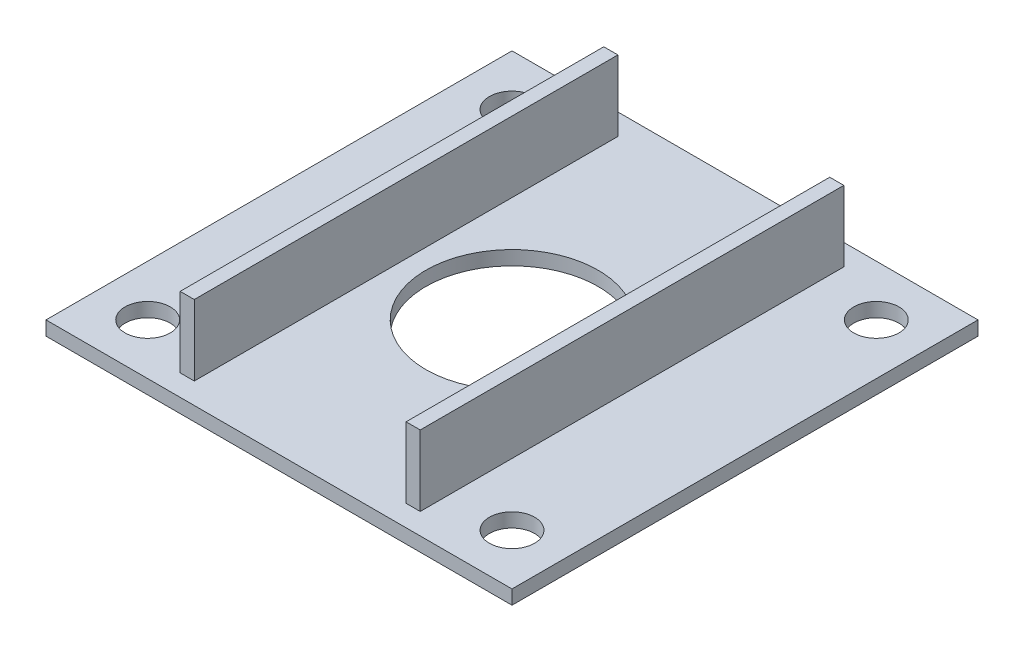
ISO-10303-21;
HEADER;
FILE_DESCRIPTION(('STEP AP214'),'2;1');
FILE_NAME('part.step','',(''),(''),'','','');
FILE_SCHEMA(('AUTOMOTIVE_DESIGN { 1 0 10303 214 1 1 1 1 }'));
ENDSEC;
DATA;
#1=APPLICATION_CONTEXT('core data for automotive mechanical design processes');
#2=APPLICATION_PROTOCOL_DEFINITION('international standard','automotive_design',2000,#1);
#3=PRODUCT_CONTEXT('',#1,'mechanical');
#4=PRODUCT('Part','Part','',(#3));
#5=PRODUCT_RELATED_PRODUCT_CATEGORY('part','',(#4));
#6=PRODUCT_DEFINITION_FORMATION('','',#4);
#7=PRODUCT_DEFINITION_CONTEXT('part definition',#1,'design');
#8=PRODUCT_DEFINITION('design','',#6,#7);
#9=PRODUCT_DEFINITION_SHAPE('','',#8);
#10=(LENGTH_UNIT() NAMED_UNIT(*) SI_UNIT(.MILLI.,.METRE.));
#11=(NAMED_UNIT(*) PLANE_ANGLE_UNIT() SI_UNIT($,.RADIAN.));
#12=(NAMED_UNIT(*) SI_UNIT($,.STERADIAN.) SOLID_ANGLE_UNIT());
#13=UNCERTAINTY_MEASURE_WITH_UNIT(LENGTH_MEASURE(1.E-05),#10,'distance_accuracy_value','');
#14=(GEOMETRIC_REPRESENTATION_CONTEXT(3) GLOBAL_UNCERTAINTY_ASSIGNED_CONTEXT((#13)) GLOBAL_UNIT_ASSIGNED_CONTEXT((#10,
#11,#12)) REPRESENTATION_CONTEXT('',''));
#15=CARTESIAN_POINT('',(0.,0.,0.));
#16=DIRECTION('',(0.,0.,1.));
#17=DIRECTION('',(1.,0.,0.));
#18=AXIS2_PLACEMENT_3D('',#15,#16,#17);
#19=CARTESIAN_POINT('',(0.,1.,0.));
#20=DIRECTION('',(0.,1.,0.));
#21=DIRECTION('',(0.,0.,1.));
#22=AXIS2_PLACEMENT_3D('',#19,#20,#21);
#23=PLANE('',#22);
#24=CARTESIAN_POINT('',(-12.9,1.,12.9));
#25=DIRECTION('',(0.,1.,0.));
#26=DIRECTION('',(0.,0.,-1.));
#27=AXIS2_PLACEMENT_3D('',#24,#25,#26);
#28=CIRCLE('',#27,1.6);
#29=CARTESIAN_POINT('',(-12.9,1.,11.3));
#30=VERTEX_POINT('',#29);
#31=EDGE_CURVE('E202',#30,#30,#28,.T.);
#32=ORIENTED_EDGE('',*,*,#31,.F.);
#33=EDGE_LOOP('',(#32));
#34=FACE_BOUND('',#33,.T.);
#35=CARTESIAN_POINT('',(12.9,1.,12.9));
#36=DIRECTION('',(0.,1.,0.));
#37=DIRECTION('',(0.,0.,1.));
#38=AXIS2_PLACEMENT_3D('',#35,#36,#37);
#39=CIRCLE('',#38,1.6);
#40=CARTESIAN_POINT('',(12.9,1.,14.5));
#41=VERTEX_POINT('',#40);
#42=EDGE_CURVE('E224',#41,#41,#39,.T.);
#43=ORIENTED_EDGE('',*,*,#42,.F.);
#44=EDGE_LOOP('',(#43));
#45=FACE_BOUND('',#44,.T.);
#46=CARTESIAN_POINT('',(12.9,1.,-12.9));
#47=DIRECTION('',(0.,1.,0.));
#48=DIRECTION('',(0.,0.,-1.));
#49=AXIS2_PLACEMENT_3D('',#46,#47,#48);
#50=CIRCLE('',#49,1.6);
#51=CARTESIAN_POINT('',(12.9,1.,-14.5));
#52=VERTEX_POINT('',#51);
#53=EDGE_CURVE('E216',#52,#52,#50,.T.);
#54=ORIENTED_EDGE('',*,*,#53,.F.);
#55=EDGE_LOOP('',(#54));
#56=FACE_BOUND('',#55,.T.);
#57=CARTESIAN_POINT('',(-12.9,1.,-12.9));
#58=DIRECTION('',(0.,1.,0.));
#59=DIRECTION('',(0.,0.,1.));
#60=AXIS2_PLACEMENT_3D('',#57,#58,#59);
#61=CIRCLE('',#60,1.6);
#62=CARTESIAN_POINT('',(-12.9,1.,-11.3));
#63=VERTEX_POINT('',#62);
#64=EDGE_CURVE('E208',#63,#63,#61,.T.);
#65=ORIENTED_EDGE('',*,*,#64,.F.);
#66=EDGE_LOOP('',(#65));
#67=FACE_BOUND('',#66,.T.);
#68=CARTESIAN_POINT('',(0.,1.,0.));
#69=DIRECTION('',(0.,1.,0.));
#70=DIRECTION('',(0.,0.,1.));
#71=AXIS2_PLACEMENT_3D('',#68,#69,#70);
#72=CIRCLE('',#71,6.1);
#73=CARTESIAN_POINT('',(0.,1.,6.1));
#74=VERTEX_POINT('',#73);
#75=EDGE_CURVE('E207',#74,#74,#72,.T.);
#76=ORIENTED_EDGE('',*,*,#75,.F.);
#77=EDGE_LOOP('',(#76));
#78=FACE_BOUND('',#77,.T.);
#79=DIRECTION('',(0.,0.,-1.));
#80=VECTOR('',#79,1.);
#81=CARTESIAN_POINT('',(16.5,1.,-16.5));
#82=LINE('',#81,#80);
#83=CARTESIAN_POINT('',(16.5,1.,16.5));
#84=VERTEX_POINT('',#83);
#85=CARTESIAN_POINT('',(16.5,1.,-16.5));
#86=VERTEX_POINT('',#85);
#87=EDGE_CURVE('E243',#84,#86,#82,.T.);
#88=ORIENTED_EDGE('',*,*,#87,.T.);
#89=DIRECTION('',(-1.,0.,0.));
#90=VECTOR('',#89,1.);
#91=CARTESIAN_POINT('',(-16.5,1.,-16.5));
#92=LINE('',#91,#90);
#93=CARTESIAN_POINT('',(-16.5,1.,-16.5));
#94=VERTEX_POINT('',#93);
#95=EDGE_CURVE('E247',#86,#94,#92,.T.);
#96=ORIENTED_EDGE('',*,*,#95,.T.);
#97=DIRECTION('',(0.,0.,1.));
#98=VECTOR('',#97,1.);
#99=CARTESIAN_POINT('',(-16.5,1.,-16.5));
#100=LINE('',#99,#98);
#101=CARTESIAN_POINT('',(-16.5,1.,16.5));
#102=VERTEX_POINT('',#101);
#103=EDGE_CURVE('E251',#94,#102,#100,.T.);
#104=ORIENTED_EDGE('',*,*,#103,.T.);
#105=DIRECTION('',(1.,0.,0.));
#106=VECTOR('',#105,1.);
#107=CARTESIAN_POINT('',(-16.5,1.,16.5));
#108=LINE('',#107,#106);
#109=EDGE_CURVE('E254',#102,#84,#108,.T.);
#110=ORIENTED_EDGE('',*,*,#109,.T.);
#111=EDGE_LOOP('',(#88,#96,#104,#110));
#112=FACE_BOUND('',#111,.T.);
#113=DIRECTION('',(1.,0.,0.));
#114=VECTOR('',#113,1.);
#115=CARTESIAN_POINT('',(-8.5,1.,15.));
#116=LINE('',#115,#114);
#117=CARTESIAN_POINT('',(-8.5,1.,15.));
#118=VERTEX_POINT('',#117);
#119=CARTESIAN_POINT('',(-7.5,1.,15.));
#120=VERTEX_POINT('',#119);
#121=EDGE_CURVE('E163',#118,#120,#116,.T.);
#122=ORIENTED_EDGE('',*,*,#121,.F.);
#123=DIRECTION('',(0.,0.,1.));
#124=VECTOR('',#123,1.);
#125=CARTESIAN_POINT('',(-8.5,1.,-15.));
#126=LINE('',#125,#124);
#127=CARTESIAN_POINT('',(-8.5,1.,-15.));
#128=VERTEX_POINT('',#127);
#129=EDGE_CURVE('E158',#128,#118,#126,.T.);
#130=ORIENTED_EDGE('',*,*,#129,.F.);
#131=DIRECTION('',(-1.,0.,0.));
#132=VECTOR('',#131,1.);
#133=CARTESIAN_POINT('',(-8.5,1.,-15.));
#134=LINE('',#133,#132);
#135=CARTESIAN_POINT('',(-7.5,1.,-15.));
#136=VERTEX_POINT('',#135);
#137=EDGE_CURVE('E173',#136,#128,#134,.T.);
#138=ORIENTED_EDGE('',*,*,#137,.F.);
#139=DIRECTION('',(0.,0.,-1.));
#140=VECTOR('',#139,1.);
#141=CARTESIAN_POINT('',(-7.5,1.,-15.));
#142=LINE('',#141,#140);
#143=EDGE_CURVE('E185',#120,#136,#142,.T.);
#144=ORIENTED_EDGE('',*,*,#143,.F.);
#145=EDGE_LOOP('',(#122,#130,#138,#144));
#146=FACE_BOUND('',#145,.T.);
#147=DIRECTION('',(0.,0.,1.));
#148=VECTOR('',#147,1.);
#149=CARTESIAN_POINT('',(7.5,1.,-15.));
#150=LINE('',#149,#148);
#151=CARTESIAN_POINT('',(7.5,1.,-15.));
#152=VERTEX_POINT('',#151);
#153=CARTESIAN_POINT('',(7.5,1.,15.));
#154=VERTEX_POINT('',#153);
#155=EDGE_CURVE('E499',#152,#154,#150,.T.);
#156=ORIENTED_EDGE('',*,*,#155,.F.);
#157=DIRECTION('',(-1.,0.,0.));
#158=VECTOR('',#157,1.);
#159=CARTESIAN_POINT('',(8.5,1.,-15.));
#160=LINE('',#159,#158);
#161=CARTESIAN_POINT('',(8.5,1.,-15.));
#162=VERTEX_POINT('',#161);
#163=EDGE_CURVE('E155',#162,#152,#160,.T.);
#164=ORIENTED_EDGE('',*,*,#163,.F.);
#165=DIRECTION('',(0.,0.,-1.));
#166=VECTOR('',#165,1.);
#167=CARTESIAN_POINT('',(8.5,1.,-15.));
#168=LINE('',#167,#166);
#169=CARTESIAN_POINT('',(8.5,1.,15.));
#170=VERTEX_POINT('',#169);
#171=EDGE_CURVE('E151',#170,#162,#168,.T.);
#172=ORIENTED_EDGE('',*,*,#171,.F.);
#173=DIRECTION('',(1.,0.,0.));
#174=VECTOR('',#173,1.);
#175=CARTESIAN_POINT('',(8.5,1.,15.));
#176=LINE('',#175,#174);
#177=EDGE_CURVE('E495',#154,#170,#176,.T.);
#178=ORIENTED_EDGE('',*,*,#177,.F.);
#179=EDGE_LOOP('',(#156,#164,#172,#178));
#180=FACE_BOUND('',#179,.T.);
#181=ADVANCED_FACE('F39',(#34,#45,#56,#67,#78,#112,#146,#180),#23,.T.);
#182=CARTESIAN_POINT('',(16.5,1.,-16.5));
#183=DIRECTION('',(-1.,0.,0.));
#184=DIRECTION('',(0.,0.,1.));
#185=AXIS2_PLACEMENT_3D('',#182,#183,#184);
#186=PLANE('',#185);
#187=DIRECTION('',(0.,0.,-1.));
#188=VECTOR('',#187,1.);
#189=CARTESIAN_POINT('',(16.5,0.,-16.5));
#190=LINE('',#189,#188);
#191=CARTESIAN_POINT('',(16.5,0.,16.5));
#192=VERTEX_POINT('',#191);
#193=CARTESIAN_POINT('',(16.5,0.,-16.5));
#194=VERTEX_POINT('',#193);
#195=EDGE_CURVE('E239',#192,#194,#190,.T.);
#196=ORIENTED_EDGE('',*,*,#195,.T.);
#197=DIRECTION('',(0.,-1.,0.));
#198=VECTOR('',#197,1.);
#199=CARTESIAN_POINT('',(16.5,1.,-16.5));
#200=LINE('',#199,#198);
#201=EDGE_CURVE('E11',#86,#194,#200,.T.);
#202=ORIENTED_EDGE('',*,*,#201,.F.);
#203=ORIENTED_EDGE('',*,*,#87,.F.);
#204=DIRECTION('',(0.,-1.,0.));
#205=VECTOR('',#204,1.);
#206=CARTESIAN_POINT('',(16.5,1.,16.5));
#207=LINE('',#206,#205);
#208=EDGE_CURVE('E257',#84,#192,#207,.T.);
#209=ORIENTED_EDGE('',*,*,#208,.T.);
#210=EDGE_LOOP('',(#196,#202,#203,#209));
#211=FACE_BOUND('',#210,.T.);
#212=ADVANCED_FACE('F41',(#211),#186,.F.);
#213=CARTESIAN_POINT('',(-16.5,1.,-16.5));
#214=DIRECTION('',(0.,0.,1.));
#215=DIRECTION('',(1.,0.,0.));
#216=AXIS2_PLACEMENT_3D('',#213,#214,#215);
#217=PLANE('',#216);
#218=DIRECTION('',(-1.,0.,0.));
#219=VECTOR('',#218,1.);
#220=CARTESIAN_POINT('',(-16.5,0.,-16.5));
#221=LINE('',#220,#219);
#222=CARTESIAN_POINT('',(-16.5,0.,-16.5));
#223=VERTEX_POINT('',#222);
#224=EDGE_CURVE('E261',#194,#223,#221,.T.);
#225=ORIENTED_EDGE('',*,*,#224,.T.);
#226=DIRECTION('',(0.,-1.,0.));
#227=VECTOR('',#226,1.);
#228=CARTESIAN_POINT('',(-16.5,1.,-16.5));
#229=LINE('',#228,#227);
#230=EDGE_CURVE('E48',#94,#223,#229,.T.);
#231=ORIENTED_EDGE('',*,*,#230,.F.);
#232=ORIENTED_EDGE('',*,*,#95,.F.);
#233=ORIENTED_EDGE('',*,*,#201,.T.);
#234=EDGE_LOOP('',(#225,#231,#232,#233));
#235=FACE_BOUND('',#234,.T.);
#236=ADVANCED_FACE('F297',(#235),#217,.F.);
#237=CARTESIAN_POINT('',(-16.5,1.,-16.5));
#238=DIRECTION('',(1.,0.,0.));
#239=DIRECTION('',(0.,0.,-1.));
#240=AXIS2_PLACEMENT_3D('',#237,#238,#239);
#241=PLANE('',#240);
#242=DIRECTION('',(0.,0.,1.));
#243=VECTOR('',#242,1.);
#244=CARTESIAN_POINT('',(-16.5,0.,-16.5));
#245=LINE('',#244,#243);
#246=CARTESIAN_POINT('',(-16.5,0.,16.5));
#247=VERTEX_POINT('',#246);
#248=EDGE_CURVE('E264',#223,#247,#245,.T.);
#249=ORIENTED_EDGE('',*,*,#248,.T.);
#250=DIRECTION('',(0.,-1.,0.));
#251=VECTOR('',#250,1.);
#252=CARTESIAN_POINT('',(-16.5,1.,16.5));
#253=LINE('',#252,#251);
#254=EDGE_CURVE('E272',#102,#247,#253,.T.);
#255=ORIENTED_EDGE('',*,*,#254,.F.);
#256=ORIENTED_EDGE('',*,*,#103,.F.);
#257=ORIENTED_EDGE('',*,*,#230,.T.);
#258=EDGE_LOOP('',(#249,#255,#256,#257));
#259=FACE_BOUND('',#258,.T.);
#260=ADVANCED_FACE('F281',(#259),#241,.F.);
#261=CARTESIAN_POINT('',(-16.5,1.,16.5));
#262=DIRECTION('',(0.,0.,-1.));
#263=DIRECTION('',(-1.,0.,0.));
#264=AXIS2_PLACEMENT_3D('',#261,#262,#263);
#265=PLANE('',#264);
#266=DIRECTION('',(1.,0.,0.));
#267=VECTOR('',#266,1.);
#268=CARTESIAN_POINT('',(-16.5,0.,16.5));
#269=LINE('',#268,#267);
#270=EDGE_CURVE('E248',#247,#192,#269,.T.);
#271=ORIENTED_EDGE('',*,*,#270,.T.);
#272=ORIENTED_EDGE('',*,*,#208,.F.);
#273=ORIENTED_EDGE('',*,*,#109,.F.);
#274=ORIENTED_EDGE('',*,*,#254,.T.);
#275=EDGE_LOOP('',(#271,#272,#273,#274));
#276=FACE_BOUND('',#275,.T.);
#277=ADVANCED_FACE('F290',(#276),#265,.F.);
#278=CARTESIAN_POINT('',(0.,0.,0.));
#279=DIRECTION('',(0.,1.,0.));
#280=DIRECTION('',(0.,0.,1.));
#281=AXIS2_PLACEMENT_3D('',#278,#279,#280);
#282=PLANE('',#281);
#283=CARTESIAN_POINT('',(-12.9,0.,12.9));
#284=DIRECTION('',(0.,1.,0.));
#285=DIRECTION('',(0.,0.,-1.));
#286=AXIS2_PLACEMENT_3D('',#283,#284,#285);
#287=CIRCLE('',#286,1.6);
#288=CARTESIAN_POINT('',(-12.9,0.,11.3));
#289=VERTEX_POINT('',#288);
#290=EDGE_CURVE('E228',#289,#289,#287,.T.);
#291=ORIENTED_EDGE('',*,*,#290,.T.);
#292=EDGE_LOOP('',(#291));
#293=FACE_BOUND('',#292,.T.);
#294=CARTESIAN_POINT('',(12.9,0.,12.9));
#295=DIRECTION('',(0.,1.,0.));
#296=DIRECTION('',(0.,0.,1.));
#297=AXIS2_PLACEMENT_3D('',#294,#295,#296);
#298=CIRCLE('',#297,1.6);
#299=CARTESIAN_POINT('',(12.9,0.,14.5));
#300=VERTEX_POINT('',#299);
#301=EDGE_CURVE('E220',#300,#300,#298,.T.);
#302=ORIENTED_EDGE('',*,*,#301,.T.);
#303=EDGE_LOOP('',(#302));
#304=FACE_BOUND('',#303,.T.);
#305=CARTESIAN_POINT('',(12.9,0.,-12.9));
#306=DIRECTION('',(0.,1.,0.));
#307=DIRECTION('',(0.,0.,-1.));
#308=AXIS2_PLACEMENT_3D('',#305,#306,#307);
#309=CIRCLE('',#308,1.6);
#310=CARTESIAN_POINT('',(12.9,0.,-14.5));
#311=VERTEX_POINT('',#310);
#312=EDGE_CURVE('E212',#311,#311,#309,.T.);
#313=ORIENTED_EDGE('',*,*,#312,.T.);
#314=EDGE_LOOP('',(#313));
#315=FACE_BOUND('',#314,.T.);
#316=CARTESIAN_POINT('',(-12.9,0.,-12.9));
#317=DIRECTION('',(0.,1.,0.));
#318=DIRECTION('',(0.,0.,1.));
#319=AXIS2_PLACEMENT_3D('',#316,#317,#318);
#320=CIRCLE('',#319,1.6);
#321=CARTESIAN_POINT('',(-12.9,0.,-11.3));
#322=VERTEX_POINT('',#321);
#323=EDGE_CURVE('E203',#322,#322,#320,.T.);
#324=ORIENTED_EDGE('',*,*,#323,.T.);
#325=EDGE_LOOP('',(#324));
#326=FACE_BOUND('',#325,.T.);
#327=CARTESIAN_POINT('',(0.,0.,0.));
#328=DIRECTION('',(0.,1.,0.));
#329=DIRECTION('',(0.,0.,1.));
#330=AXIS2_PLACEMENT_3D('',#327,#328,#329);
#331=CIRCLE('',#330,6.1);
#332=CARTESIAN_POINT('',(0.,0.,6.1));
#333=VERTEX_POINT('',#332);
#334=EDGE_CURVE('E235',#333,#333,#331,.T.);
#335=ORIENTED_EDGE('',*,*,#334,.T.);
#336=EDGE_LOOP('',(#335));
#337=FACE_BOUND('',#336,.T.);
#338=ORIENTED_EDGE('',*,*,#195,.F.);
#339=ORIENTED_EDGE('',*,*,#270,.F.);
#340=ORIENTED_EDGE('',*,*,#248,.F.);
#341=ORIENTED_EDGE('',*,*,#224,.F.);
#342=EDGE_LOOP('',(#338,#339,#340,#341));
#343=FACE_BOUND('',#342,.T.);
#344=ADVANCED_FACE('F287',(#293,#304,#315,#326,#337,#343),#282,.F.);
#345=CARTESIAN_POINT('',(0.,0.,0.));
#346=DIRECTION('',(0.,1.,0.));
#347=DIRECTION('',(0.,0.,1.));
#348=AXIS2_PLACEMENT_3D('',#345,#346,#347);
#349=CYLINDRICAL_SURFACE('',#348,6.1);
#350=ORIENTED_EDGE('',*,*,#334,.F.);
#351=EDGE_LOOP('',(#350));
#352=FACE_BOUND('',#351,.T.);
#353=ORIENTED_EDGE('',*,*,#75,.T.);
#354=EDGE_LOOP('',(#353));
#355=FACE_BOUND('',#354,.T.);
#356=ADVANCED_FACE('F313',(#352,#355),#349,.F.);
#357=CARTESIAN_POINT('',(-12.9,0.,-12.9));
#358=DIRECTION('',(0.,1.,0.));
#359=DIRECTION('',(0.,0.,1.));
#360=AXIS2_PLACEMENT_3D('',#357,#358,#359);
#361=CYLINDRICAL_SURFACE('',#360,1.6);
#362=ORIENTED_EDGE('',*,*,#323,.F.);
#363=EDGE_LOOP('',(#362));
#364=FACE_BOUND('',#363,.T.);
#365=ORIENTED_EDGE('',*,*,#64,.T.);
#366=EDGE_LOOP('',(#365));
#367=FACE_BOUND('',#366,.T.);
#368=ADVANCED_FACE('F333',(#364,#367),#361,.F.);
#369=CARTESIAN_POINT('',(12.9,0.,-12.9));
#370=DIRECTION('',(0.,1.,0.));
#371=DIRECTION('',(0.,0.,1.));
#372=AXIS2_PLACEMENT_3D('',#369,#370,#371);
#373=CYLINDRICAL_SURFACE('',#372,1.6);
#374=ORIENTED_EDGE('',*,*,#312,.F.);
#375=EDGE_LOOP('',(#374));
#376=FACE_BOUND('',#375,.T.);
#377=ORIENTED_EDGE('',*,*,#53,.T.);
#378=EDGE_LOOP('',(#377));
#379=FACE_BOUND('',#378,.T.);
#380=ADVANCED_FACE('F340',(#376,#379),#373,.F.);
#381=CARTESIAN_POINT('',(12.9,0.,12.9));
#382=DIRECTION('',(0.,1.,0.));
#383=DIRECTION('',(0.,0.,1.));
#384=AXIS2_PLACEMENT_3D('',#381,#382,#383);
#385=CYLINDRICAL_SURFACE('',#384,1.6);
#386=ORIENTED_EDGE('',*,*,#301,.F.);
#387=EDGE_LOOP('',(#386));
#388=FACE_BOUND('',#387,.T.);
#389=ORIENTED_EDGE('',*,*,#42,.T.);
#390=EDGE_LOOP('',(#389));
#391=FACE_BOUND('',#390,.T.);
#392=ADVANCED_FACE('F348',(#388,#391),#385,.F.);
#393=CARTESIAN_POINT('',(-12.9,0.,12.9));
#394=DIRECTION('',(0.,1.,0.));
#395=DIRECTION('',(0.,0.,1.));
#396=AXIS2_PLACEMENT_3D('',#393,#394,#395);
#397=CYLINDRICAL_SURFACE('',#396,1.6);
#398=ORIENTED_EDGE('',*,*,#290,.F.);
#399=EDGE_LOOP('',(#398));
#400=FACE_BOUND('',#399,.T.);
#401=ORIENTED_EDGE('',*,*,#31,.T.);
#402=EDGE_LOOP('',(#401));
#403=FACE_BOUND('',#402,.T.);
#404=ADVANCED_FACE('F356',(#400,#403),#397,.F.);
#405=CARTESIAN_POINT('',(-8.5,6.,-15.));
#406=DIRECTION('',(1.,0.,0.));
#407=DIRECTION('',(0.,0.,-1.));
#408=AXIS2_PLACEMENT_3D('',#405,#406,#407);
#409=PLANE('',#408);
#410=ORIENTED_EDGE('',*,*,#129,.T.);
#411=DIRECTION('',(0.,-1.,0.));
#412=VECTOR('',#411,1.);
#413=CARTESIAN_POINT('',(-8.5,6.,15.));
#414=LINE('',#413,#412);
#415=CARTESIAN_POINT('',(-8.5,6.,15.));
#416=VERTEX_POINT('',#415);
#417=EDGE_CURVE('E199',#416,#118,#414,.T.);
#418=ORIENTED_EDGE('',*,*,#417,.F.);
#419=DIRECTION('',(0.,0.,1.));
#420=VECTOR('',#419,1.);
#421=CARTESIAN_POINT('',(-8.5,6.,-15.));
#422=LINE('',#421,#420);
#423=CARTESIAN_POINT('',(-8.5,6.,-15.));
#424=VERTEX_POINT('',#423);
#425=EDGE_CURVE('E168',#424,#416,#422,.T.);
#426=ORIENTED_EDGE('',*,*,#425,.F.);
#427=DIRECTION('',(0.,-1.,0.));
#428=VECTOR('',#427,1.);
#429=CARTESIAN_POINT('',(-8.5,6.,-15.));
#430=LINE('',#429,#428);
#431=EDGE_CURVE('E181',#424,#128,#430,.T.);
#432=ORIENTED_EDGE('',*,*,#431,.T.);
#433=EDGE_LOOP('',(#410,#418,#426,#432));
#434=FACE_BOUND('',#433,.T.);
#435=ADVANCED_FACE('F364',(#434),#409,.F.);
#436=CARTESIAN_POINT('',(-8.5,6.,15.));
#437=DIRECTION('',(0.,0.,-1.));
#438=DIRECTION('',(-1.,0.,0.));
#439=AXIS2_PLACEMENT_3D('',#436,#437,#438);
#440=PLANE('',#439);
#441=ORIENTED_EDGE('',*,*,#121,.T.);
#442=DIRECTION('',(0.,-1.,0.));
#443=VECTOR('',#442,1.);
#444=CARTESIAN_POINT('',(-7.5,6.,15.));
#445=LINE('',#444,#443);
#446=CARTESIAN_POINT('',(-7.5,6.,15.));
#447=VERTEX_POINT('',#446);
#448=EDGE_CURVE('E195',#447,#120,#445,.T.);
#449=ORIENTED_EDGE('',*,*,#448,.F.);
#450=DIRECTION('',(1.,0.,0.));
#451=VECTOR('',#450,1.);
#452=CARTESIAN_POINT('',(-8.5,6.,15.));
#453=LINE('',#452,#451);
#454=EDGE_CURVE('E172',#416,#447,#453,.T.);
#455=ORIENTED_EDGE('',*,*,#454,.F.);
#456=ORIENTED_EDGE('',*,*,#417,.T.);
#457=EDGE_LOOP('',(#441,#449,#455,#456));
#458=FACE_BOUND('',#457,.T.);
#459=ADVANCED_FACE('F371',(#458),#440,.F.);
#460=CARTESIAN_POINT('',(-7.5,6.,-15.));
#461=DIRECTION('',(-1.,0.,0.));
#462=DIRECTION('',(0.,0.,1.));
#463=AXIS2_PLACEMENT_3D('',#460,#461,#462);
#464=PLANE('',#463);
#465=ORIENTED_EDGE('',*,*,#143,.T.);
#466=DIRECTION('',(0.,-1.,0.));
#467=VECTOR('',#466,1.);
#468=CARTESIAN_POINT('',(-7.5,6.,-15.));
#469=LINE('',#468,#467);
#470=CARTESIAN_POINT('',(-7.5,6.,-15.));
#471=VERTEX_POINT('',#470);
#472=EDGE_CURVE('E63',#471,#136,#469,.T.);
#473=ORIENTED_EDGE('',*,*,#472,.F.);
#474=DIRECTION('',(0.,0.,-1.));
#475=VECTOR('',#474,1.);
#476=CARTESIAN_POINT('',(-7.5,6.,-15.));
#477=LINE('',#476,#475);
#478=EDGE_CURVE('E176',#447,#471,#477,.T.);
#479=ORIENTED_EDGE('',*,*,#478,.F.);
#480=ORIENTED_EDGE('',*,*,#448,.T.);
#481=EDGE_LOOP('',(#465,#473,#479,#480));
#482=FACE_BOUND('',#481,.T.);
#483=ADVANCED_FACE('F379',(#482),#464,.F.);
#484=CARTESIAN_POINT('',(-8.5,6.,-15.));
#485=DIRECTION('',(0.,0.,1.));
#486=DIRECTION('',(1.,0.,0.));
#487=AXIS2_PLACEMENT_3D('',#484,#485,#486);
#488=PLANE('',#487);
#489=ORIENTED_EDGE('',*,*,#137,.T.);
#490=ORIENTED_EDGE('',*,*,#431,.F.);
#491=DIRECTION('',(-1.,0.,0.));
#492=VECTOR('',#491,1.);
#493=CARTESIAN_POINT('',(-8.5,6.,-15.));
#494=LINE('',#493,#492);
#495=EDGE_CURVE('E179',#471,#424,#494,.T.);
#496=ORIENTED_EDGE('',*,*,#495,.F.);
#497=ORIENTED_EDGE('',*,*,#472,.T.);
#498=EDGE_LOOP('',(#489,#490,#496,#497));
#499=FACE_BOUND('',#498,.T.);
#500=ADVANCED_FACE('F387',(#499),#488,.F.);
#501=CARTESIAN_POINT('',(0.,6.,0.));
#502=DIRECTION('',(0.,1.,0.));
#503=DIRECTION('',(0.,0.,1.));
#504=AXIS2_PLACEMENT_3D('',#501,#502,#503);
#505=PLANE('',#504);
#506=ORIENTED_EDGE('',*,*,#425,.T.);
#507=ORIENTED_EDGE('',*,*,#454,.T.);
#508=ORIENTED_EDGE('',*,*,#478,.T.);
#509=ORIENTED_EDGE('',*,*,#495,.T.);
#510=EDGE_LOOP('',(#506,#507,#508,#509));
#511=FACE_BOUND('',#510,.T.);
#512=ADVANCED_FACE('F395',(#511),#505,.T.);
#513=CARTESIAN_POINT('',(8.5,6.,-15.));
#514=DIRECTION('',(0.,0.,1.));
#515=DIRECTION('',(1.,0.,0.));
#516=AXIS2_PLACEMENT_3D('',#513,#514,#515);
#517=PLANE('',#516);
#518=ORIENTED_EDGE('',*,*,#163,.T.);
#519=DIRECTION('',(0.,-1.,0.));
#520=VECTOR('',#519,1.);
#521=CARTESIAN_POINT('',(7.5,6.,-15.));
#522=LINE('',#521,#520);
#523=CARTESIAN_POINT('',(7.5,6.,-15.));
#524=VERTEX_POINT('',#523);
#525=EDGE_CURVE('E134',#524,#152,#522,.T.);
#526=ORIENTED_EDGE('',*,*,#525,.F.);
#527=DIRECTION('',(-1.,0.,0.));
#528=VECTOR('',#527,1.);
#529=CARTESIAN_POINT('',(8.5,6.,-15.));
#530=LINE('',#529,#528);
#531=CARTESIAN_POINT('',(8.5,6.,-15.));
#532=VERTEX_POINT('',#531);
#533=EDGE_CURVE('E142',#532,#524,#530,.T.);
#534=ORIENTED_EDGE('',*,*,#533,.F.);
#535=DIRECTION('',(0.,-1.,0.));
#536=VECTOR('',#535,1.);
#537=CARTESIAN_POINT('',(8.5,6.,-15.));
#538=LINE('',#537,#536);
#539=EDGE_CURVE('E491',#532,#162,#538,.T.);
#540=ORIENTED_EDGE('',*,*,#539,.T.);
#541=EDGE_LOOP('',(#518,#526,#534,#540));
#542=FACE_BOUND('',#541,.T.);
#543=ADVANCED_FACE('F153',(#542),#517,.F.);
#544=CARTESIAN_POINT('',(7.5,6.,-15.));
#545=DIRECTION('',(1.,0.,0.));
#546=DIRECTION('',(0.,0.,-1.));
#547=AXIS2_PLACEMENT_3D('',#544,#545,#546);
#548=PLANE('',#547);
#549=ORIENTED_EDGE('',*,*,#155,.T.);
#550=DIRECTION('',(0.,-1.,0.));
#551=VECTOR('',#550,1.);
#552=CARTESIAN_POINT('',(7.5,6.,15.));
#553=LINE('',#552,#551);
#554=CARTESIAN_POINT('',(7.5,6.,15.));
#555=VERTEX_POINT('',#554);
#556=EDGE_CURVE('E137',#555,#154,#553,.T.);
#557=ORIENTED_EDGE('',*,*,#556,.F.);
#558=DIRECTION('',(0.,0.,1.));
#559=VECTOR('',#558,1.);
#560=CARTESIAN_POINT('',(7.5,6.,-15.));
#561=LINE('',#560,#559);
#562=EDGE_CURVE('E130',#524,#555,#561,.T.);
#563=ORIENTED_EDGE('',*,*,#562,.F.);
#564=ORIENTED_EDGE('',*,*,#525,.T.);
#565=EDGE_LOOP('',(#549,#557,#563,#564));
#566=FACE_BOUND('',#565,.T.);
#567=ADVANCED_FACE('F132',(#566),#548,.F.);
#568=CARTESIAN_POINT('',(8.5,6.,15.));
#569=DIRECTION('',(0.,0.,-1.));
#570=DIRECTION('',(-1.,0.,0.));
#571=AXIS2_PLACEMENT_3D('',#568,#569,#570);
#572=PLANE('',#571);
#573=ORIENTED_EDGE('',*,*,#177,.T.);
#574=DIRECTION('',(0.,-1.,0.));
#575=VECTOR('',#574,1.);
#576=CARTESIAN_POINT('',(8.5,6.,15.));
#577=LINE('',#576,#575);
#578=CARTESIAN_POINT('',(8.5,6.,15.));
#579=VERTEX_POINT('',#578);
#580=EDGE_CURVE('E55',#579,#170,#577,.T.);
#581=ORIENTED_EDGE('',*,*,#580,.F.);
#582=DIRECTION('',(1.,0.,0.));
#583=VECTOR('',#582,1.);
#584=CARTESIAN_POINT('',(8.5,6.,15.));
#585=LINE('',#584,#583);
#586=EDGE_CURVE('E141',#555,#579,#585,.T.);
#587=ORIENTED_EDGE('',*,*,#586,.F.);
#588=ORIENTED_EDGE('',*,*,#556,.T.);
#589=EDGE_LOOP('',(#573,#581,#587,#588));
#590=FACE_BOUND('',#589,.T.);
#591=ADVANCED_FACE('F415',(#590),#572,.F.);
#592=CARTESIAN_POINT('',(8.5,6.,-15.));
#593=DIRECTION('',(-1.,0.,0.));
#594=DIRECTION('',(0.,0.,1.));
#595=AXIS2_PLACEMENT_3D('',#592,#593,#594);
#596=PLANE('',#595);
#597=ORIENTED_EDGE('',*,*,#171,.T.);
#598=ORIENTED_EDGE('',*,*,#539,.F.);
#599=DIRECTION('',(0.,0.,-1.));
#600=VECTOR('',#599,1.);
#601=CARTESIAN_POINT('',(8.5,6.,-15.));
#602=LINE('',#601,#600);
#603=EDGE_CURVE('E146',#579,#532,#602,.T.);
#604=ORIENTED_EDGE('',*,*,#603,.F.);
#605=ORIENTED_EDGE('',*,*,#580,.T.);
#606=EDGE_LOOP('',(#597,#598,#604,#605));
#607=FACE_BOUND('',#606,.T.);
#608=ADVANCED_FACE('F422',(#607),#596,.F.);
#609=CARTESIAN_POINT('',(0.,6.,0.));
#610=DIRECTION('',(0.,1.,0.));
#611=DIRECTION('',(0.,0.,1.));
#612=AXIS2_PLACEMENT_3D('',#609,#610,#611);
#613=PLANE('',#612);
#614=ORIENTED_EDGE('',*,*,#533,.T.);
#615=ORIENTED_EDGE('',*,*,#562,.T.);
#616=ORIENTED_EDGE('',*,*,#586,.T.);
#617=ORIENTED_EDGE('',*,*,#603,.T.);
#618=EDGE_LOOP('',(#614,#615,#616,#617));
#619=FACE_BOUND('',#618,.T.);
#620=ADVANCED_FACE('F145',(#619),#613,.T.);
#621=CLOSED_SHELL('',(#181,#212,#236,#260,#277,#344,#356,#368,#380,#392,#404,#435,#459,#483,
#500,#512,#543,#567,#591,#608,#620));
#622=MANIFOLD_SOLID_BREP('B2',#621);
#623=ADVANCED_BREP_SHAPE_REPRESENTATION('',(#18,#622),#14);
#624=SHAPE_DEFINITION_REPRESENTATION(#9,#623);
ENDSEC;
END-ISO-10303-21;
